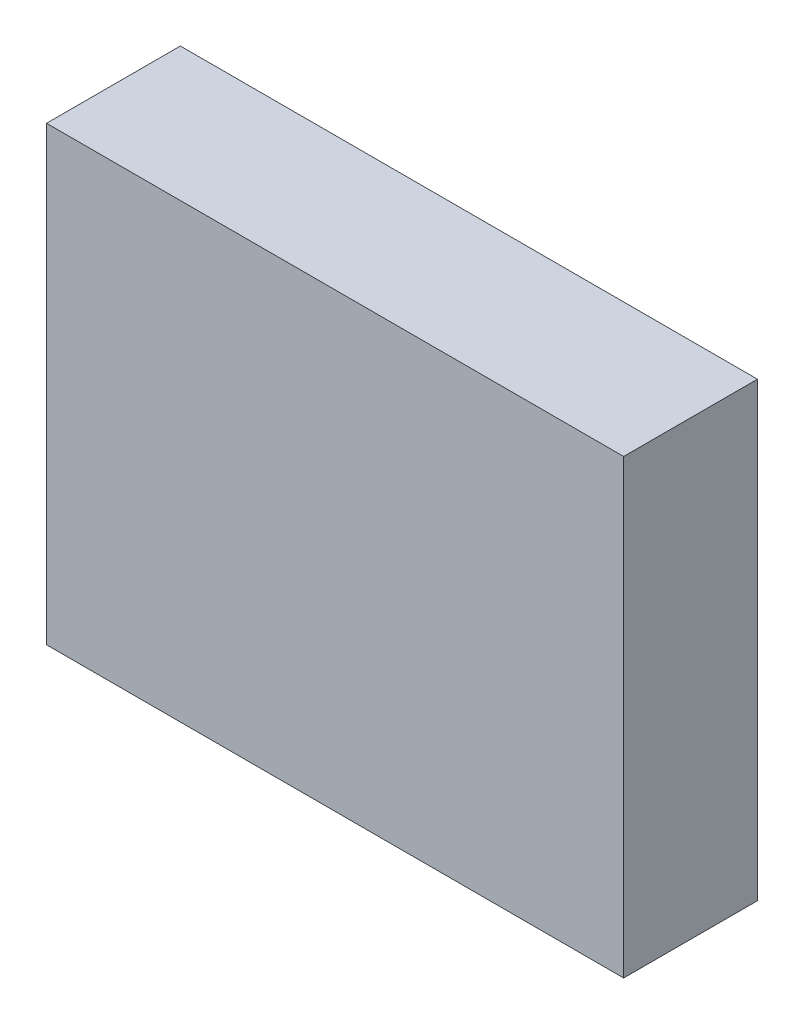
ISO-10303-21;
HEADER;
FILE_DESCRIPTION(('STEP AP214'),'2;1');
FILE_NAME('part.step','',(''),(''),'','','');
FILE_SCHEMA(('AUTOMOTIVE_DESIGN { 1 0 10303 214 1 1 1 1 }'));
ENDSEC;
DATA;
#1=APPLICATION_CONTEXT('core data for automotive mechanical design processes');
#2=APPLICATION_PROTOCOL_DEFINITION('international standard','automotive_design',2000,#1);
#3=PRODUCT_CONTEXT('',#1,'mechanical');
#4=PRODUCT('Part','Part','',(#3));
#5=PRODUCT_RELATED_PRODUCT_CATEGORY('part','',(#4));
#6=PRODUCT_DEFINITION_FORMATION('','',#4);
#7=PRODUCT_DEFINITION_CONTEXT('part definition',#1,'design');
#8=PRODUCT_DEFINITION('design','',#6,#7);
#9=PRODUCT_DEFINITION_SHAPE('','',#8);
#10=(LENGTH_UNIT() NAMED_UNIT(*) SI_UNIT(.MILLI.,.METRE.));
#11=(NAMED_UNIT(*) PLANE_ANGLE_UNIT() SI_UNIT($,.RADIAN.));
#12=(NAMED_UNIT(*) SI_UNIT($,.STERADIAN.) SOLID_ANGLE_UNIT());
#13=UNCERTAINTY_MEASURE_WITH_UNIT(LENGTH_MEASURE(1.E-05),#10,'distance_accuracy_value','');
#14=(GEOMETRIC_REPRESENTATION_CONTEXT(3) GLOBAL_UNCERTAINTY_ASSIGNED_CONTEXT((#13)) GLOBAL_UNIT_ASSIGNED_CONTEXT((#10,
#11,#12)) REPRESENTATION_CONTEXT('',''));
#15=CARTESIAN_POINT('',(0.,0.,0.));
#16=DIRECTION('',(0.,0.,1.));
#17=DIRECTION('',(1.,0.,0.));
#18=AXIS2_PLACEMENT_3D('',#15,#16,#17);
#19=CARTESIAN_POINT('',(0.,0.,16.));
#20=DIRECTION('',(1.,0.,0.));
#21=DIRECTION('',(0.,0.,-1.));
#22=AXIS2_PLACEMENT_3D('',#19,#20,#21);
#23=PLANE('',#22);
#24=DIRECTION('',(0.,-1.,0.));
#25=VECTOR('',#24,1.);
#26=CARTESIAN_POINT('',(0.,0.,0.));
#27=LINE('',#26,#25);
#28=CARTESIAN_POINT('',(0.,54.,0.));
#29=VERTEX_POINT('',#28);
#30=CARTESIAN_POINT('',(0.,0.,0.));
#31=VERTEX_POINT('',#30);
#32=EDGE_CURVE('E105',#29,#31,#27,.T.);
#33=ORIENTED_EDGE('',*,*,#32,.T.);
#34=DIRECTION('',(0.,0.,-1.));
#35=VECTOR('',#34,1.);
#36=CARTESIAN_POINT('',(0.,0.,16.));
#37=LINE('',#36,#35);
#38=CARTESIAN_POINT('',(0.,0.,16.));
#39=VERTEX_POINT('',#38);
#40=EDGE_CURVE('E11',#39,#31,#37,.T.);
#41=ORIENTED_EDGE('',*,*,#40,.F.);
#42=DIRECTION('',(0.,-1.,0.));
#43=VECTOR('',#42,1.);
#44=CARTESIAN_POINT('',(0.,0.,16.));
#45=LINE('',#44,#43);
#46=CARTESIAN_POINT('',(0.,54.,16.));
#47=VERTEX_POINT('',#46);
#48=EDGE_CURVE('E89',#47,#39,#45,.T.);
#49=ORIENTED_EDGE('',*,*,#48,.F.);
#50=DIRECTION('',(0.,0.,-1.));
#51=VECTOR('',#50,1.);
#52=CARTESIAN_POINT('',(0.,54.,16.));
#53=LINE('',#52,#51);
#54=EDGE_CURVE('E97',#47,#29,#53,.T.);
#55=ORIENTED_EDGE('',*,*,#54,.T.);
#56=EDGE_LOOP('',(#33,#41,#49,#55));
#57=FACE_BOUND('',#56,.T.);
#58=ADVANCED_FACE('F39',(#57),#23,.F.);
#59=CARTESIAN_POINT('',(0.,0.,16.));
#60=DIRECTION('',(0.,1.,0.));
#61=DIRECTION('',(0.,0.,1.));
#62=AXIS2_PLACEMENT_3D('',#59,#60,#61);
#63=PLANE('',#62);
#64=DIRECTION('',(1.,0.,0.));
#65=VECTOR('',#64,1.);
#66=CARTESIAN_POINT('',(0.,0.,0.));
#67=LINE('',#66,#65);
#68=CARTESIAN_POINT('',(69.,0.,0.));
#69=VERTEX_POINT('',#68);
#70=EDGE_CURVE('E92',#31,#69,#67,.T.);
#71=ORIENTED_EDGE('',*,*,#70,.T.);
#72=DIRECTION('',(0.,0.,-1.));
#73=VECTOR('',#72,1.);
#74=CARTESIAN_POINT('',(69.,0.,16.));
#75=LINE('',#74,#73);
#76=CARTESIAN_POINT('',(69.,0.,16.));
#77=VERTEX_POINT('',#76);
#78=EDGE_CURVE('E50',#77,#69,#75,.T.);
#79=ORIENTED_EDGE('',*,*,#78,.F.);
#80=DIRECTION('',(1.,0.,0.));
#81=VECTOR('',#80,1.);
#82=CARTESIAN_POINT('',(0.,0.,16.));
#83=LINE('',#82,#81);
#84=EDGE_CURVE('E82',#39,#77,#83,.T.);
#85=ORIENTED_EDGE('',*,*,#84,.F.);
#86=ORIENTED_EDGE('',*,*,#40,.T.);
#87=EDGE_LOOP('',(#71,#79,#85,#86));
#88=FACE_BOUND('',#87,.T.);
#89=ADVANCED_FACE('F93',(#88),#63,.F.);
#90=CARTESIAN_POINT('',(69.,0.,16.));
#91=DIRECTION('',(-1.,0.,0.));
#92=DIRECTION('',(0.,0.,1.));
#93=AXIS2_PLACEMENT_3D('',#90,#91,#92);
#94=PLANE('',#93);
#95=DIRECTION('',(0.,1.,0.));
#96=VECTOR('',#95,1.);
#97=CARTESIAN_POINT('',(69.,0.,0.));
#98=LINE('',#97,#96);
#99=CARTESIAN_POINT('',(69.,54.,0.));
#100=VERTEX_POINT('',#99);
#101=EDGE_CURVE('E72',#69,#100,#98,.T.);
#102=ORIENTED_EDGE('',*,*,#101,.T.);
#103=DIRECTION('',(0.,0.,-1.));
#104=VECTOR('',#103,1.);
#105=CARTESIAN_POINT('',(69.,54.,16.));
#106=LINE('',#105,#104);
#107=CARTESIAN_POINT('',(69.,54.,16.));
#108=VERTEX_POINT('',#107);
#109=EDGE_CURVE('E94',#108,#100,#106,.T.);
#110=ORIENTED_EDGE('',*,*,#109,.F.);
#111=DIRECTION('',(0.,1.,0.));
#112=VECTOR('',#111,1.);
#113=CARTESIAN_POINT('',(69.,0.,16.));
#114=LINE('',#113,#112);
#115=EDGE_CURVE('E88',#77,#108,#114,.T.);
#116=ORIENTED_EDGE('',*,*,#115,.F.);
#117=ORIENTED_EDGE('',*,*,#78,.T.);
#118=EDGE_LOOP('',(#102,#110,#116,#117));
#119=FACE_BOUND('',#118,.T.);
#120=ADVANCED_FACE('F96',(#119),#94,.F.);
#121=CARTESIAN_POINT('',(0.,54.,16.));
#122=DIRECTION('',(0.,-1.,0.));
#123=DIRECTION('',(0.,0.,-1.));
#124=AXIS2_PLACEMENT_3D('',#121,#122,#123);
#125=PLANE('',#124);
#126=DIRECTION('',(-1.,0.,0.));
#127=VECTOR('',#126,1.);
#128=CARTESIAN_POINT('',(0.,54.,0.));
#129=LINE('',#128,#127);
#130=EDGE_CURVE('E76',#100,#29,#129,.T.);
#131=ORIENTED_EDGE('',*,*,#130,.T.);
#132=ORIENTED_EDGE('',*,*,#54,.F.);
#133=DIRECTION('',(-1.,0.,0.));
#134=VECTOR('',#133,1.);
#135=CARTESIAN_POINT('',(0.,54.,16.));
#136=LINE('',#135,#134);
#137=EDGE_CURVE('E54',#108,#47,#136,.T.);
#138=ORIENTED_EDGE('',*,*,#137,.F.);
#139=ORIENTED_EDGE('',*,*,#109,.T.);
#140=EDGE_LOOP('',(#131,#132,#138,#139));
#141=FACE_BOUND('',#140,.T.);
#142=ADVANCED_FACE('F108',(#141),#125,.F.);
#143=CARTESIAN_POINT('',(0.,0.,16.));
#144=DIRECTION('',(0.,0.,-1.));
#145=DIRECTION('',(-1.,0.,0.));
#146=AXIS2_PLACEMENT_3D('',#143,#144,#145);
#147=PLANE('',#146);
#148=ORIENTED_EDGE('',*,*,#48,.T.);
#149=ORIENTED_EDGE('',*,*,#84,.T.);
#150=ORIENTED_EDGE('',*,*,#115,.T.);
#151=ORIENTED_EDGE('',*,*,#137,.T.);
#152=EDGE_LOOP('',(#148,#149,#150,#151));
#153=FACE_BOUND('',#152,.T.);
#154=ADVANCED_FACE('F86',(#153),#147,.F.);
#155=CARTESIAN_POINT('',(0.,0.,0.));
#156=DIRECTION('',(0.,0.,-1.));
#157=DIRECTION('',(-1.,0.,0.));
#158=AXIS2_PLACEMENT_3D('',#155,#156,#157);
#159=PLANE('',#158);
#160=ORIENTED_EDGE('',*,*,#32,.F.);
#161=ORIENTED_EDGE('',*,*,#130,.F.);
#162=ORIENTED_EDGE('',*,*,#101,.F.);
#163=ORIENTED_EDGE('',*,*,#70,.F.);
#164=EDGE_LOOP('',(#160,#161,#162,#163));
#165=FACE_BOUND('',#164,.T.);
#166=ADVANCED_FACE('F115',(#165),#159,.T.);
#167=CLOSED_SHELL('',(#58,#89,#120,#142,#154,#166));
#168=MANIFOLD_SOLID_BREP('B2',#167);
#169=ADVANCED_BREP_SHAPE_REPRESENTATION('',(#18,#168),#14);
#170=SHAPE_DEFINITION_REPRESENTATION(#9,#169);
ENDSEC;
END-ISO-10303-21;
